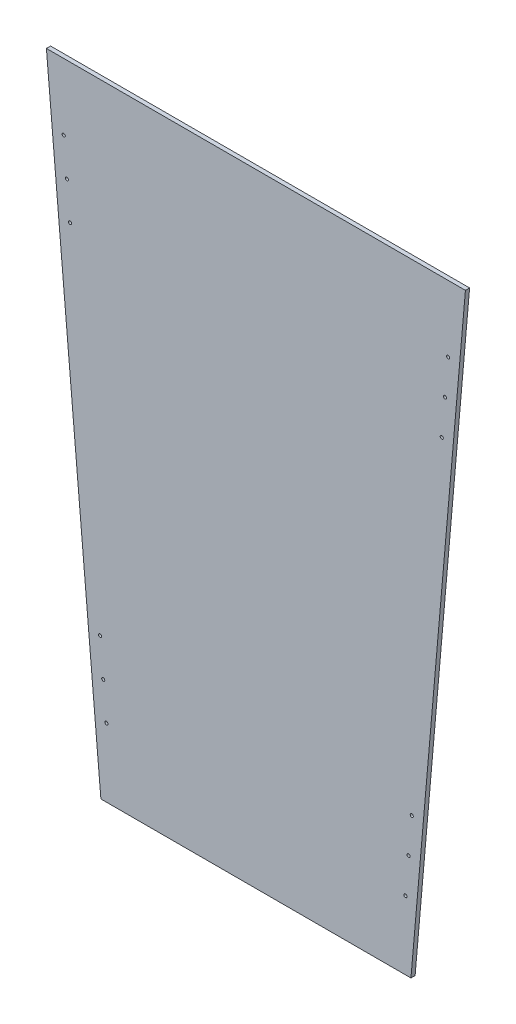
ISO-10303-21;
HEADER;
FILE_DESCRIPTION(('STEP AP214'),'2;1');
FILE_NAME('part.step','',(''),(''),'','','');
FILE_SCHEMA(('AUTOMOTIVE_DESIGN { 1 0 10303 214 1 1 1 1 }'));
ENDSEC;
DATA;
#1=APPLICATION_CONTEXT('core data for automotive mechanical design processes');
#2=APPLICATION_PROTOCOL_DEFINITION('international standard','automotive_design',2000,#1);
#3=PRODUCT_CONTEXT('',#1,'mechanical');
#4=PRODUCT('Part','Part','',(#3));
#5=PRODUCT_RELATED_PRODUCT_CATEGORY('part','',(#4));
#6=PRODUCT_DEFINITION_FORMATION('','',#4);
#7=PRODUCT_DEFINITION_CONTEXT('part definition',#1,'design');
#8=PRODUCT_DEFINITION('design','',#6,#7);
#9=PRODUCT_DEFINITION_SHAPE('','',#8);
#10=(LENGTH_UNIT() NAMED_UNIT(*) SI_UNIT(.MILLI.,.METRE.));
#11=(NAMED_UNIT(*) PLANE_ANGLE_UNIT() SI_UNIT($,.RADIAN.));
#12=(NAMED_UNIT(*) SI_UNIT($,.STERADIAN.) SOLID_ANGLE_UNIT());
#13=UNCERTAINTY_MEASURE_WITH_UNIT(LENGTH_MEASURE(1.E-05),#10,'distance_accuracy_value','');
#14=(GEOMETRIC_REPRESENTATION_CONTEXT(3) GLOBAL_UNCERTAINTY_ASSIGNED_CONTEXT((#13)) GLOBAL_UNIT_ASSIGNED_CONTEXT((#10,
#11,#12)) REPRESENTATION_CONTEXT('',''));
#15=CARTESIAN_POINT('',(0.,0.,0.));
#16=DIRECTION('',(0.,0.,1.));
#17=DIRECTION('',(1.,0.,0.));
#18=AXIS2_PLACEMENT_3D('',#15,#16,#17);
#19=CARTESIAN_POINT('',(0.,0.,4.));
#20=DIRECTION('',(0.,0.,1.));
#21=DIRECTION('',(1.,0.,0.));
#22=AXIS2_PLACEMENT_3D('',#19,#20,#21);
#23=PLANE('',#22);
#24=CARTESIAN_POINT('',(181.410784430504,411.8561177119,4.));
#25=DIRECTION('',(0.,0.,1.));
#26=DIRECTION('',(-1.,0.,0.));
#27=AXIS2_PLACEMENT_3D('',#24,#25,#26);
#28=CIRCLE('',#27,1.5);
#29=CARTESIAN_POINT('',(179.910784430504,411.8561177119,4.));
#30=VERTEX_POINT('',#29);
#31=EDGE_CURVE('E177',#30,#30,#28,.T.);
#32=ORIENTED_EDGE('',*,*,#31,.F.);
#33=EDGE_LOOP('',(#32));
#34=FACE_BOUND('',#33,.T.);
#35=CARTESIAN_POINT('',(149.597902093338,48.2429321451107,4.));
#36=DIRECTION('',(0.,0.,1.));
#37=DIRECTION('',(-1.,0.,0.));
#38=AXIS2_PLACEMENT_3D('',#35,#36,#37);
#39=CIRCLE('',#38,1.5);
#40=CARTESIAN_POINT('',(148.097902093338,48.2429321451107,4.));
#41=VERTEX_POINT('',#40);
#42=EDGE_CURVE('E165',#41,#41,#39,.T.);
#43=ORIENTED_EDGE('',*,*,#42,.F.);
#44=EDGE_LOOP('',(#43));
#45=FACE_BOUND('',#44,.T.);
#46=CARTESIAN_POINT('',(143.497000101002,-21.4906967213114,4.));
#47=DIRECTION('',(0.,0.,1.));
#48=DIRECTION('',(-1.,0.,0.));
#49=AXIS2_PLACEMENT_3D('',#46,#47,#48);
#50=CIRCLE('',#49,1.5);
#51=CARTESIAN_POINT('',(141.997000101002,-21.4906967213114,4.));
#52=VERTEX_POINT('',#51);
#53=EDGE_CURVE('E153',#52,#52,#50,.T.);
#54=ORIENTED_EDGE('',*,*,#53,.F.);
#55=EDGE_LOOP('',(#54));
#56=FACE_BOUND('',#55,.T.);
#57=CARTESIAN_POINT('',(-181.410784430504,411.8561177119,4.));
#58=DIRECTION('',(0.,0.,1.));
#59=DIRECTION('',(1.,0.,0.));
#60=AXIS2_PLACEMENT_3D('',#57,#58,#59);
#61=CIRCLE('',#60,1.5);
#62=CARTESIAN_POINT('',(-179.910784430504,411.8561177119,4.));
#63=VERTEX_POINT('',#62);
#64=EDGE_CURVE('E141',#63,#63,#61,.T.);
#65=ORIENTED_EDGE('',*,*,#64,.F.);
#66=EDGE_LOOP('',(#65));
#67=FACE_BOUND('',#66,.T.);
#68=CARTESIAN_POINT('',(-146.54745109717,13.3761177118997,4.));
#69=DIRECTION('',(0.,0.,1.));
#70=DIRECTION('',(1.,0.,0.));
#71=AXIS2_PLACEMENT_3D('',#68,#69,#70);
#72=CIRCLE('',#71,1.5);
#73=CARTESIAN_POINT('',(-145.04745109717,13.3761177118997,4.));
#74=VERTEX_POINT('',#73);
#75=EDGE_CURVE('E129',#74,#74,#72,.T.);
#76=ORIENTED_EDGE('',*,*,#75,.F.);
#77=EDGE_LOOP('',(#76));
#78=FACE_BOUND('',#77,.T.);
#79=CARTESIAN_POINT('',(-143.497000101002,-21.4906967213114,4.));
#80=DIRECTION('',(0.,0.,1.));
#81=DIRECTION('',(1.,0.,0.));
#82=AXIS2_PLACEMENT_3D('',#79,#80,#81);
#83=CIRCLE('',#82,1.5);
#84=CARTESIAN_POINT('',(-141.997000101002,-21.4906967213114,4.));
#85=VERTEX_POINT('',#84);
#86=EDGE_CURVE('E108',#85,#85,#83,.T.);
#87=ORIENTED_EDGE('',*,*,#86,.F.);
#88=EDGE_LOOP('',(#87));
#89=FACE_BOUND('',#88,.T.);
#90=DIRECTION('',(0.0871578533097518,0.996194513439236,0.));
#91=VECTOR('',#90,1.);
#92=CARTESIAN_POINT('',(201.085,510.519303278689,4.));
#93=LINE('',#92,#91);
#94=CARTESIAN_POINT('',(148.79,-87.2006967213115,4.));
#95=VERTEX_POINT('',#94);
#96=CARTESIAN_POINT('',(201.085,510.519303278689,4.));
#97=VERTEX_POINT('',#96);
#98=EDGE_CURVE('E93',#95,#97,#93,.T.);
#99=ORIENTED_EDGE('',*,*,#98,.T.);
#100=DIRECTION('',(-1.,0.,0.));
#101=VECTOR('',#100,1.);
#102=CARTESIAN_POINT('',(-201.085,510.519303278689,4.));
#103=LINE('',#102,#101);
#104=CARTESIAN_POINT('',(-201.085,510.519303278689,4.));
#105=VERTEX_POINT('',#104);
#106=EDGE_CURVE('E88',#97,#105,#103,.T.);
#107=ORIENTED_EDGE('',*,*,#106,.T.);
#108=DIRECTION('',(0.0871578533097518,-0.996194513439236,0.));
#109=VECTOR('',#108,1.);
#110=CARTESIAN_POINT('',(-201.085,510.519303278689,4.));
#111=LINE('',#110,#109);
#112=CARTESIAN_POINT('',(-148.79,-87.2006967213115,4.));
#113=VERTEX_POINT('',#112);
#114=EDGE_CURVE('E91',#105,#113,#111,.T.);
#115=ORIENTED_EDGE('',*,*,#114,.T.);
#116=DIRECTION('',(1.,0.,0.));
#117=VECTOR('',#116,1.);
#118=CARTESIAN_POINT('',(-148.79,-87.2006967213115,4.));
#119=LINE('',#118,#117);
#120=EDGE_CURVE('E58',#113,#95,#119,.T.);
#121=ORIENTED_EDGE('',*,*,#120,.T.);
#122=EDGE_LOOP('',(#99,#107,#115,#121));
#123=FACE_BOUND('',#122,.T.);
#124=CARTESIAN_POINT('',(-178.360333434335,376.989303278689,4.));
#125=DIRECTION('',(0.,0.,1.));
#126=DIRECTION('',(1.,0.,0.));
#127=AXIS2_PLACEMENT_3D('',#124,#125,#126);
#128=CIRCLE('',#127,1.5);
#129=CARTESIAN_POINT('',(-176.860333434335,376.989303278689,4.));
#130=VERTEX_POINT('',#129);
#131=EDGE_CURVE('E123',#130,#130,#128,.T.);
#132=ORIENTED_EDGE('',*,*,#131,.F.);
#133=EDGE_LOOP('',(#132));
#134=FACE_BOUND('',#133,.T.);
#135=CARTESIAN_POINT('',(-149.597902093338,48.2429321451107,4.));
#136=DIRECTION('',(0.,0.,1.));
#137=DIRECTION('',(1.,0.,0.));
#138=AXIS2_PLACEMENT_3D('',#135,#136,#137);
#139=CIRCLE('',#138,1.5);
#140=CARTESIAN_POINT('',(-148.097902093338,48.2429321451107,4.));
#141=VERTEX_POINT('',#140);
#142=EDGE_CURVE('E135',#141,#141,#139,.T.);
#143=ORIENTED_EDGE('',*,*,#142,.F.);
#144=EDGE_LOOP('',(#143));
#145=FACE_BOUND('',#144,.T.);
#146=CARTESIAN_POINT('',(-184.461235426672,446.722932145111,4.));
#147=DIRECTION('',(0.,0.,1.));
#148=DIRECTION('',(1.,0.,0.));
#149=AXIS2_PLACEMENT_3D('',#146,#147,#148);
#150=CIRCLE('',#149,1.5);
#151=CARTESIAN_POINT('',(-182.961235426672,446.722932145111,4.));
#152=VERTEX_POINT('',#151);
#153=EDGE_CURVE('E147',#152,#152,#150,.T.);
#154=ORIENTED_EDGE('',*,*,#153,.F.);
#155=EDGE_LOOP('',(#154));
#156=FACE_BOUND('',#155,.T.);
#157=CARTESIAN_POINT('',(146.54745109717,13.3761177118997,4.));
#158=DIRECTION('',(0.,0.,1.));
#159=DIRECTION('',(-1.,0.,0.));
#160=AXIS2_PLACEMENT_3D('',#157,#158,#159);
#161=CIRCLE('',#160,1.5);
#162=CARTESIAN_POINT('',(145.04745109717,13.3761177118997,4.));
#163=VERTEX_POINT('',#162);
#164=EDGE_CURVE('E159',#163,#163,#161,.T.);
#165=ORIENTED_EDGE('',*,*,#164,.F.);
#166=EDGE_LOOP('',(#165));
#167=FACE_BOUND('',#166,.T.);
#168=CARTESIAN_POINT('',(178.360333434335,376.989303278689,4.));
#169=DIRECTION('',(0.,0.,1.));
#170=DIRECTION('',(-1.,0.,0.));
#171=AXIS2_PLACEMENT_3D('',#168,#169,#170);
#172=CIRCLE('',#171,1.5);
#173=CARTESIAN_POINT('',(176.860333434335,376.989303278689,4.));
#174=VERTEX_POINT('',#173);
#175=EDGE_CURVE('E171',#174,#174,#172,.T.);
#176=ORIENTED_EDGE('',*,*,#175,.F.);
#177=EDGE_LOOP('',(#176));
#178=FACE_BOUND('',#177,.T.);
#179=CARTESIAN_POINT('',(184.461235426672,446.722932145111,4.));
#180=DIRECTION('',(0.,0.,1.));
#181=DIRECTION('',(-1.,0.,0.));
#182=AXIS2_PLACEMENT_3D('',#179,#180,#181);
#183=CIRCLE('',#182,1.5);
#184=CARTESIAN_POINT('',(182.961235426672,446.722932145111,4.));
#185=VERTEX_POINT('',#184);
#186=EDGE_CURVE('E183',#185,#185,#183,.T.);
#187=ORIENTED_EDGE('',*,*,#186,.F.);
#188=EDGE_LOOP('',(#187));
#189=FACE_BOUND('',#188,.T.);
#190=ADVANCED_FACE('F41',(#34,#45,#56,#67,#78,#89,#123,#134,#145,#156,#167,#178,#189),#23,.T.);
#191=CARTESIAN_POINT('',(0.,0.,0.));
#192=DIRECTION('',(0.,0.,1.));
#193=DIRECTION('',(1.,0.,0.));
#194=AXIS2_PLACEMENT_3D('',#191,#192,#193);
#195=PLANE('',#194);
#196=DIRECTION('',(0.0871578533097518,0.996194513439236,0.));
#197=VECTOR('',#196,1.);
#198=CARTESIAN_POINT('',(201.085,510.519303278689,0.));
#199=LINE('',#198,#197);
#200=CARTESIAN_POINT('',(148.79,-87.2006967213115,0.));
#201=VERTEX_POINT('',#200);
#202=CARTESIAN_POINT('',(201.085,510.519303278689,0.));
#203=VERTEX_POINT('',#202);
#204=EDGE_CURVE('E105',#201,#203,#199,.T.);
#205=ORIENTED_EDGE('',*,*,#204,.F.);
#206=DIRECTION('',(1.,0.,0.));
#207=VECTOR('',#206,1.);
#208=CARTESIAN_POINT('',(-148.79,-87.2006967213115,0.));
#209=LINE('',#208,#207);
#210=CARTESIAN_POINT('',(-148.79,-87.2006967213115,0.));
#211=VERTEX_POINT('',#210);
#212=EDGE_CURVE('E81',#211,#201,#209,.T.);
#213=ORIENTED_EDGE('',*,*,#212,.F.);
#214=DIRECTION('',(0.0871578533097518,-0.996194513439236,0.));
#215=VECTOR('',#214,1.);
#216=CARTESIAN_POINT('',(-201.085,510.519303278689,0.));
#217=LINE('',#216,#215);
#218=CARTESIAN_POINT('',(-201.085,510.519303278689,0.));
#219=VERTEX_POINT('',#218);
#220=EDGE_CURVE('E75',#219,#211,#217,.T.);
#221=ORIENTED_EDGE('',*,*,#220,.F.);
#222=DIRECTION('',(-1.,0.,0.));
#223=VECTOR('',#222,1.);
#224=CARTESIAN_POINT('',(-201.085,510.519303278689,0.));
#225=LINE('',#224,#223);
#226=EDGE_CURVE('E97',#203,#219,#225,.T.);
#227=ORIENTED_EDGE('',*,*,#226,.F.);
#228=EDGE_LOOP('',(#205,#213,#221,#227));
#229=FACE_BOUND('',#228,.T.);
#230=CARTESIAN_POINT('',(-143.497000101002,-21.4906967213114,0.));
#231=DIRECTION('',(0.,0.,1.));
#232=DIRECTION('',(1.,0.,0.));
#233=AXIS2_PLACEMENT_3D('',#230,#231,#232);
#234=CIRCLE('',#233,1.5);
#235=CARTESIAN_POINT('',(-141.997000101002,-21.4906967213114,0.));
#236=VERTEX_POINT('',#235);
#237=EDGE_CURVE('E120',#236,#236,#234,.T.);
#238=ORIENTED_EDGE('',*,*,#237,.T.);
#239=EDGE_LOOP('',(#238));
#240=FACE_BOUND('',#239,.T.);
#241=CARTESIAN_POINT('',(-178.360333434335,376.989303278689,0.));
#242=DIRECTION('',(0.,0.,1.));
#243=DIRECTION('',(1.,0.,0.));
#244=AXIS2_PLACEMENT_3D('',#241,#242,#243);
#245=CIRCLE('',#244,1.5);
#246=CARTESIAN_POINT('',(-176.860333434335,376.989303278689,0.));
#247=VERTEX_POINT('',#246);
#248=EDGE_CURVE('E126',#247,#247,#245,.T.);
#249=ORIENTED_EDGE('',*,*,#248,.T.);
#250=EDGE_LOOP('',(#249));
#251=FACE_BOUND('',#250,.T.);
#252=CARTESIAN_POINT('',(-146.54745109717,13.3761177118997,0.));
#253=DIRECTION('',(0.,0.,1.));
#254=DIRECTION('',(1.,0.,0.));
#255=AXIS2_PLACEMENT_3D('',#252,#253,#254);
#256=CIRCLE('',#255,1.5);
#257=CARTESIAN_POINT('',(-145.04745109717,13.3761177118997,0.));
#258=VERTEX_POINT('',#257);
#259=EDGE_CURVE('E132',#258,#258,#256,.T.);
#260=ORIENTED_EDGE('',*,*,#259,.T.);
#261=EDGE_LOOP('',(#260));
#262=FACE_BOUND('',#261,.T.);
#263=CARTESIAN_POINT('',(-149.597902093338,48.2429321451107,0.));
#264=DIRECTION('',(0.,0.,1.));
#265=DIRECTION('',(1.,0.,0.));
#266=AXIS2_PLACEMENT_3D('',#263,#264,#265);
#267=CIRCLE('',#266,1.5);
#268=CARTESIAN_POINT('',(-148.097902093338,48.2429321451107,0.));
#269=VERTEX_POINT('',#268);
#270=EDGE_CURVE('E138',#269,#269,#267,.T.);
#271=ORIENTED_EDGE('',*,*,#270,.T.);
#272=EDGE_LOOP('',(#271));
#273=FACE_BOUND('',#272,.T.);
#274=CARTESIAN_POINT('',(-181.410784430504,411.8561177119,0.));
#275=DIRECTION('',(0.,0.,1.));
#276=DIRECTION('',(1.,0.,0.));
#277=AXIS2_PLACEMENT_3D('',#274,#275,#276);
#278=CIRCLE('',#277,1.5);
#279=CARTESIAN_POINT('',(-179.910784430504,411.8561177119,0.));
#280=VERTEX_POINT('',#279);
#281=EDGE_CURVE('E144',#280,#280,#278,.T.);
#282=ORIENTED_EDGE('',*,*,#281,.T.);
#283=EDGE_LOOP('',(#282));
#284=FACE_BOUND('',#283,.T.);
#285=CARTESIAN_POINT('',(-184.461235426672,446.722932145111,0.));
#286=DIRECTION('',(0.,0.,1.));
#287=DIRECTION('',(1.,0.,0.));
#288=AXIS2_PLACEMENT_3D('',#285,#286,#287);
#289=CIRCLE('',#288,1.5);
#290=CARTESIAN_POINT('',(-182.961235426672,446.722932145111,0.));
#291=VERTEX_POINT('',#290);
#292=EDGE_CURVE('E150',#291,#291,#289,.T.);
#293=ORIENTED_EDGE('',*,*,#292,.T.);
#294=EDGE_LOOP('',(#293));
#295=FACE_BOUND('',#294,.T.);
#296=CARTESIAN_POINT('',(143.497000101002,-21.4906967213114,0.));
#297=DIRECTION('',(0.,0.,1.));
#298=DIRECTION('',(-1.,0.,0.));
#299=AXIS2_PLACEMENT_3D('',#296,#297,#298);
#300=CIRCLE('',#299,1.5);
#301=CARTESIAN_POINT('',(141.997000101002,-21.4906967213114,0.));
#302=VERTEX_POINT('',#301);
#303=EDGE_CURVE('E156',#302,#302,#300,.T.);
#304=ORIENTED_EDGE('',*,*,#303,.T.);
#305=EDGE_LOOP('',(#304));
#306=FACE_BOUND('',#305,.T.);
#307=CARTESIAN_POINT('',(146.54745109717,13.3761177118997,0.));
#308=DIRECTION('',(0.,0.,1.));
#309=DIRECTION('',(-1.,0.,0.));
#310=AXIS2_PLACEMENT_3D('',#307,#308,#309);
#311=CIRCLE('',#310,1.5);
#312=CARTESIAN_POINT('',(145.04745109717,13.3761177118997,0.));
#313=VERTEX_POINT('',#312);
#314=EDGE_CURVE('E162',#313,#313,#311,.T.);
#315=ORIENTED_EDGE('',*,*,#314,.T.);
#316=EDGE_LOOP('',(#315));
#317=FACE_BOUND('',#316,.T.);
#318=CARTESIAN_POINT('',(149.597902093338,48.2429321451107,0.));
#319=DIRECTION('',(0.,0.,1.));
#320=DIRECTION('',(-1.,0.,0.));
#321=AXIS2_PLACEMENT_3D('',#318,#319,#320);
#322=CIRCLE('',#321,1.5);
#323=CARTESIAN_POINT('',(148.097902093338,48.2429321451107,0.));
#324=VERTEX_POINT('',#323);
#325=EDGE_CURVE('E168',#324,#324,#322,.T.);
#326=ORIENTED_EDGE('',*,*,#325,.T.);
#327=EDGE_LOOP('',(#326));
#328=FACE_BOUND('',#327,.T.);
#329=CARTESIAN_POINT('',(178.360333434335,376.989303278689,0.));
#330=DIRECTION('',(0.,0.,1.));
#331=DIRECTION('',(-1.,0.,0.));
#332=AXIS2_PLACEMENT_3D('',#329,#330,#331);
#333=CIRCLE('',#332,1.5);
#334=CARTESIAN_POINT('',(176.860333434335,376.989303278689,0.));
#335=VERTEX_POINT('',#334);
#336=EDGE_CURVE('E174',#335,#335,#333,.T.);
#337=ORIENTED_EDGE('',*,*,#336,.T.);
#338=EDGE_LOOP('',(#337));
#339=FACE_BOUND('',#338,.T.);
#340=CARTESIAN_POINT('',(181.410784430504,411.8561177119,0.));
#341=DIRECTION('',(0.,0.,1.));
#342=DIRECTION('',(-1.,0.,0.));
#343=AXIS2_PLACEMENT_3D('',#340,#341,#342);
#344=CIRCLE('',#343,1.5);
#345=CARTESIAN_POINT('',(179.910784430504,411.8561177119,0.));
#346=VERTEX_POINT('',#345);
#347=EDGE_CURVE('E180',#346,#346,#344,.T.);
#348=ORIENTED_EDGE('',*,*,#347,.T.);
#349=EDGE_LOOP('',(#348));
#350=FACE_BOUND('',#349,.T.);
#351=CARTESIAN_POINT('',(184.461235426672,446.722932145111,0.));
#352=DIRECTION('',(0.,0.,1.));
#353=DIRECTION('',(-1.,0.,0.));
#354=AXIS2_PLACEMENT_3D('',#351,#352,#353);
#355=CIRCLE('',#354,1.5);
#356=CARTESIAN_POINT('',(182.961235426672,446.722932145111,0.));
#357=VERTEX_POINT('',#356);
#358=EDGE_CURVE('E186',#357,#357,#355,.T.);
#359=ORIENTED_EDGE('',*,*,#358,.T.);
#360=EDGE_LOOP('',(#359));
#361=FACE_BOUND('',#360,.T.);
#362=ADVANCED_FACE('F116',(#229,#240,#251,#262,#273,#284,#295,#306,#317,#328,#339,#350,#361),
#195,.F.);
#363=CARTESIAN_POINT('',(201.085,510.519303278689,4.));
#364=DIRECTION('',(-0.996194513439236,0.0871578533097518,0.));
#365=DIRECTION('',(-0.0871578533097518,-0.996194513439236,0.));
#366=AXIS2_PLACEMENT_3D('',#363,#364,#365);
#367=PLANE('',#366);
#368=ORIENTED_EDGE('',*,*,#204,.T.);
#369=DIRECTION('',(0.,0.,-1.));
#370=VECTOR('',#369,1.);
#371=CARTESIAN_POINT('',(201.085,510.519303278689,4.));
#372=LINE('',#371,#370);
#373=EDGE_CURVE('E11',#97,#203,#372,.T.);
#374=ORIENTED_EDGE('',*,*,#373,.F.);
#375=ORIENTED_EDGE('',*,*,#98,.F.);
#376=DIRECTION('',(0.,0.,-1.));
#377=VECTOR('',#376,1.);
#378=CARTESIAN_POINT('',(148.79,-87.2006967213115,4.));
#379=LINE('',#378,#377);
#380=EDGE_CURVE('E101',#95,#201,#379,.T.);
#381=ORIENTED_EDGE('',*,*,#380,.T.);
#382=EDGE_LOOP('',(#368,#374,#375,#381));
#383=FACE_BOUND('',#382,.T.);
#384=ADVANCED_FACE('F43',(#383),#367,.F.);
#385=CARTESIAN_POINT('',(-201.085,510.519303278689,4.));
#386=DIRECTION('',(0.,-1.,0.));
#387=DIRECTION('',(0.,0.,-1.));
#388=AXIS2_PLACEMENT_3D('',#385,#386,#387);
#389=PLANE('',#388);
#390=ORIENTED_EDGE('',*,*,#226,.T.);
#391=DIRECTION('',(0.,0.,-1.));
#392=VECTOR('',#391,1.);
#393=CARTESIAN_POINT('',(-201.085,510.519303278689,4.));
#394=LINE('',#393,#392);
#395=EDGE_CURVE('E50',#105,#219,#394,.T.);
#396=ORIENTED_EDGE('',*,*,#395,.F.);
#397=ORIENTED_EDGE('',*,*,#106,.F.);
#398=ORIENTED_EDGE('',*,*,#373,.T.);
#399=EDGE_LOOP('',(#390,#396,#397,#398));
#400=FACE_BOUND('',#399,.T.);
#401=ADVANCED_FACE('F96',(#400),#389,.F.);
#402=CARTESIAN_POINT('',(-201.085,510.519303278689,4.));
#403=DIRECTION('',(0.996194513439236,0.0871578533097518,0.));
#404=DIRECTION('',(-0.0871578533097518,0.996194513439236,0.));
#405=AXIS2_PLACEMENT_3D('',#402,#403,#404);
#406=PLANE('',#405);
#407=ORIENTED_EDGE('',*,*,#220,.T.);
#408=DIRECTION('',(0.,0.,-1.));
#409=VECTOR('',#408,1.);
#410=CARTESIAN_POINT('',(-148.79,-87.2006967213115,4.));
#411=LINE('',#410,#409);
#412=EDGE_CURVE('E98',#113,#211,#411,.T.);
#413=ORIENTED_EDGE('',*,*,#412,.F.);
#414=ORIENTED_EDGE('',*,*,#114,.F.);
#415=ORIENTED_EDGE('',*,*,#395,.T.);
#416=EDGE_LOOP('',(#407,#413,#414,#415));
#417=FACE_BOUND('',#416,.T.);
#418=ADVANCED_FACE('F99',(#417),#406,.F.);
#419=CARTESIAN_POINT('',(-148.79,-87.2006967213115,4.));
#420=DIRECTION('',(0.,1.,0.));
#421=DIRECTION('',(0.,0.,1.));
#422=AXIS2_PLACEMENT_3D('',#419,#420,#421);
#423=PLANE('',#422);
#424=ORIENTED_EDGE('',*,*,#212,.T.);
#425=ORIENTED_EDGE('',*,*,#380,.F.);
#426=ORIENTED_EDGE('',*,*,#120,.F.);
#427=ORIENTED_EDGE('',*,*,#412,.T.);
#428=EDGE_LOOP('',(#424,#425,#426,#427));
#429=FACE_BOUND('',#428,.T.);
#430=ADVANCED_FACE('F113',(#429),#423,.F.);
#431=CARTESIAN_POINT('',(-143.497000101002,-21.4906967213114,4.));
#432=DIRECTION('',(0.,0.,-1.));
#433=DIRECTION('',(-1.,0.,0.));
#434=AXIS2_PLACEMENT_3D('',#431,#432,#433);
#435=CYLINDRICAL_SURFACE('',#434,1.5);
#436=ORIENTED_EDGE('',*,*,#86,.T.);
#437=EDGE_LOOP('',(#436));
#438=FACE_BOUND('',#437,.T.);
#439=ORIENTED_EDGE('',*,*,#237,.F.);
#440=EDGE_LOOP('',(#439));
#441=FACE_BOUND('',#440,.T.);
#442=ADVANCED_FACE('F205',(#438,#441),#435,.F.);
#443=CARTESIAN_POINT('',(-178.360333434335,376.989303278689,4.));
#444=DIRECTION('',(0.,0.,-1.));
#445=DIRECTION('',(-1.,0.,0.));
#446=AXIS2_PLACEMENT_3D('',#443,#444,#445);
#447=CYLINDRICAL_SURFACE('',#446,1.5);
#448=ORIENTED_EDGE('',*,*,#131,.T.);
#449=EDGE_LOOP('',(#448));
#450=FACE_BOUND('',#449,.T.);
#451=ORIENTED_EDGE('',*,*,#248,.F.);
#452=EDGE_LOOP('',(#451));
#453=FACE_BOUND('',#452,.T.);
#454=ADVANCED_FACE('F250',(#450,#453),#447,.F.);
#455=CARTESIAN_POINT('',(-146.54745109717,13.3761177118997,4.));
#456=DIRECTION('',(0.,0.,-1.));
#457=DIRECTION('',(-1.,0.,0.));
#458=AXIS2_PLACEMENT_3D('',#455,#456,#457);
#459=CYLINDRICAL_SURFACE('',#458,1.5);
#460=ORIENTED_EDGE('',*,*,#75,.T.);
#461=EDGE_LOOP('',(#460));
#462=FACE_BOUND('',#461,.T.);
#463=ORIENTED_EDGE('',*,*,#259,.F.);
#464=EDGE_LOOP('',(#463));
#465=FACE_BOUND('',#464,.T.);
#466=ADVANCED_FACE('F258',(#462,#465),#459,.F.);
#467=CARTESIAN_POINT('',(-149.597902093338,48.2429321451107,4.));
#468=DIRECTION('',(0.,0.,-1.));
#469=DIRECTION('',(-1.,0.,0.));
#470=AXIS2_PLACEMENT_3D('',#467,#468,#469);
#471=CYLINDRICAL_SURFACE('',#470,1.5);
#472=ORIENTED_EDGE('',*,*,#142,.T.);
#473=EDGE_LOOP('',(#472));
#474=FACE_BOUND('',#473,.T.);
#475=ORIENTED_EDGE('',*,*,#270,.F.);
#476=EDGE_LOOP('',(#475));
#477=FACE_BOUND('',#476,.T.);
#478=ADVANCED_FACE('F266',(#474,#477),#471,.F.);
#479=CARTESIAN_POINT('',(-181.410784430504,411.8561177119,4.));
#480=DIRECTION('',(0.,0.,-1.));
#481=DIRECTION('',(-1.,0.,0.));
#482=AXIS2_PLACEMENT_3D('',#479,#480,#481);
#483=CYLINDRICAL_SURFACE('',#482,1.5);
#484=ORIENTED_EDGE('',*,*,#64,.T.);
#485=EDGE_LOOP('',(#484));
#486=FACE_BOUND('',#485,.T.);
#487=ORIENTED_EDGE('',*,*,#281,.F.);
#488=EDGE_LOOP('',(#487));
#489=FACE_BOUND('',#488,.T.);
#490=ADVANCED_FACE('F275',(#486,#489),#483,.F.);
#491=CARTESIAN_POINT('',(-184.461235426672,446.722932145111,4.));
#492=DIRECTION('',(0.,0.,-1.));
#493=DIRECTION('',(-1.,0.,0.));
#494=AXIS2_PLACEMENT_3D('',#491,#492,#493);
#495=CYLINDRICAL_SURFACE('',#494,1.5);
#496=ORIENTED_EDGE('',*,*,#153,.T.);
#497=EDGE_LOOP('',(#496));
#498=FACE_BOUND('',#497,.T.);
#499=ORIENTED_EDGE('',*,*,#292,.F.);
#500=EDGE_LOOP('',(#499));
#501=FACE_BOUND('',#500,.T.);
#502=ADVANCED_FACE('F284',(#498,#501),#495,.F.);
#503=CARTESIAN_POINT('',(143.497000101002,-21.4906967213114,4.));
#504=DIRECTION('',(0.,0.,-1.));
#505=DIRECTION('',(-1.,0.,0.));
#506=AXIS2_PLACEMENT_3D('',#503,#504,#505);
#507=CYLINDRICAL_SURFACE('',#506,1.5);
#508=ORIENTED_EDGE('',*,*,#53,.T.);
#509=EDGE_LOOP('',(#508));
#510=FACE_BOUND('',#509,.T.);
#511=ORIENTED_EDGE('',*,*,#303,.F.);
#512=EDGE_LOOP('',(#511));
#513=FACE_BOUND('',#512,.T.);
#514=ADVANCED_FACE('F293',(#510,#513),#507,.F.);
#515=CARTESIAN_POINT('',(146.54745109717,13.3761177118997,4.));
#516=DIRECTION('',(0.,0.,-1.));
#517=DIRECTION('',(-1.,0.,0.));
#518=AXIS2_PLACEMENT_3D('',#515,#516,#517);
#519=CYLINDRICAL_SURFACE('',#518,1.5);
#520=ORIENTED_EDGE('',*,*,#164,.T.);
#521=EDGE_LOOP('',(#520));
#522=FACE_BOUND('',#521,.T.);
#523=ORIENTED_EDGE('',*,*,#314,.F.);
#524=EDGE_LOOP('',(#523));
#525=FACE_BOUND('',#524,.T.);
#526=ADVANCED_FACE('F302',(#522,#525),#519,.F.);
#527=CARTESIAN_POINT('',(149.597902093338,48.2429321451107,4.));
#528=DIRECTION('',(0.,0.,-1.));
#529=DIRECTION('',(-1.,0.,0.));
#530=AXIS2_PLACEMENT_3D('',#527,#528,#529);
#531=CYLINDRICAL_SURFACE('',#530,1.5);
#532=ORIENTED_EDGE('',*,*,#42,.T.);
#533=EDGE_LOOP('',(#532));
#534=FACE_BOUND('',#533,.T.);
#535=ORIENTED_EDGE('',*,*,#325,.F.);
#536=EDGE_LOOP('',(#535));
#537=FACE_BOUND('',#536,.T.);
#538=ADVANCED_FACE('F311',(#534,#537),#531,.F.);
#539=CARTESIAN_POINT('',(178.360333434335,376.989303278689,4.));
#540=DIRECTION('',(0.,0.,-1.));
#541=DIRECTION('',(-1.,0.,0.));
#542=AXIS2_PLACEMENT_3D('',#539,#540,#541);
#543=CYLINDRICAL_SURFACE('',#542,1.5);
#544=ORIENTED_EDGE('',*,*,#175,.T.);
#545=EDGE_LOOP('',(#544));
#546=FACE_BOUND('',#545,.T.);
#547=ORIENTED_EDGE('',*,*,#336,.F.);
#548=EDGE_LOOP('',(#547));
#549=FACE_BOUND('',#548,.T.);
#550=ADVANCED_FACE('F320',(#546,#549),#543,.F.);
#551=CARTESIAN_POINT('',(181.410784430504,411.8561177119,4.));
#552=DIRECTION('',(0.,0.,-1.));
#553=DIRECTION('',(-1.,0.,0.));
#554=AXIS2_PLACEMENT_3D('',#551,#552,#553);
#555=CYLINDRICAL_SURFACE('',#554,1.5);
#556=ORIENTED_EDGE('',*,*,#31,.T.);
#557=EDGE_LOOP('',(#556));
#558=FACE_BOUND('',#557,.T.);
#559=ORIENTED_EDGE('',*,*,#347,.F.);
#560=EDGE_LOOP('',(#559));
#561=FACE_BOUND('',#560,.T.);
#562=ADVANCED_FACE('F329',(#558,#561),#555,.F.);
#563=CARTESIAN_POINT('',(184.461235426672,446.722932145111,4.));
#564=DIRECTION('',(0.,0.,-1.));
#565=DIRECTION('',(-1.,0.,0.));
#566=AXIS2_PLACEMENT_3D('',#563,#564,#565);
#567=CYLINDRICAL_SURFACE('',#566,1.5);
#568=ORIENTED_EDGE('',*,*,#186,.T.);
#569=EDGE_LOOP('',(#568));
#570=FACE_BOUND('',#569,.T.);
#571=ORIENTED_EDGE('',*,*,#358,.F.);
#572=EDGE_LOOP('',(#571));
#573=FACE_BOUND('',#572,.T.);
#574=ADVANCED_FACE('F192',(#570,#573),#567,.F.);
#575=CLOSED_SHELL('',(#190,#362,#384,#401,#418,#430,#442,#454,#466,#478,#490,#502,#514,#526,
#538,#550,#562,#574));
#576=MANIFOLD_SOLID_BREP('B2',#575);
#577=ADVANCED_BREP_SHAPE_REPRESENTATION('',(#18,#576),#14);
#578=SHAPE_DEFINITION_REPRESENTATION(#9,#577);
ENDSEC;
END-ISO-10303-21;
